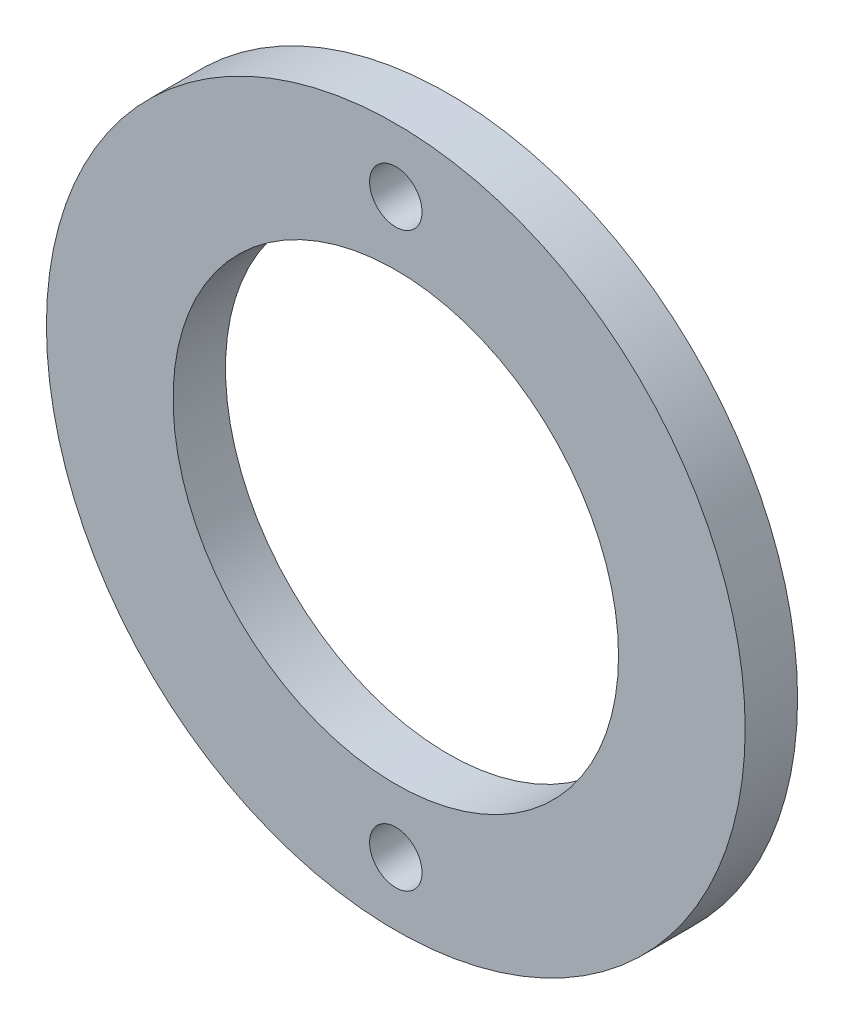
ISO-10303-21;
HEADER;
FILE_DESCRIPTION(('STEP AP214'),'2;1');
FILE_NAME('part.step','',(''),(''),'','','');
FILE_SCHEMA(('AUTOMOTIVE_DESIGN { 1 0 10303 214 1 1 1 1 }'));
ENDSEC;
DATA;
#1=APPLICATION_CONTEXT('core data for automotive mechanical design processes');
#2=APPLICATION_PROTOCOL_DEFINITION('international standard','automotive_design',2000,#1);
#3=PRODUCT_CONTEXT('',#1,'mechanical');
#4=PRODUCT('Part','Part','',(#3));
#5=PRODUCT_RELATED_PRODUCT_CATEGORY('part','',(#4));
#6=PRODUCT_DEFINITION_FORMATION('','',#4);
#7=PRODUCT_DEFINITION_CONTEXT('part definition',#1,'design');
#8=PRODUCT_DEFINITION('design','',#6,#7);
#9=PRODUCT_DEFINITION_SHAPE('','',#8);
#10=(LENGTH_UNIT() NAMED_UNIT(*) SI_UNIT(.MILLI.,.METRE.));
#11=(NAMED_UNIT(*) PLANE_ANGLE_UNIT() SI_UNIT($,.RADIAN.));
#12=(NAMED_UNIT(*) SI_UNIT($,.STERADIAN.) SOLID_ANGLE_UNIT());
#13=UNCERTAINTY_MEASURE_WITH_UNIT(LENGTH_MEASURE(1.E-05),#10,'distance_accuracy_value','');
#14=(GEOMETRIC_REPRESENTATION_CONTEXT(3) GLOBAL_UNCERTAINTY_ASSIGNED_CONTEXT((#13)) GLOBAL_UNIT_ASSIGNED_CONTEXT((#10,
#11,#12)) REPRESENTATION_CONTEXT('',''));
#15=CARTESIAN_POINT('',(0.,0.,0.));
#16=DIRECTION('',(0.,0.,1.));
#17=DIRECTION('',(1.,0.,0.));
#18=AXIS2_PLACEMENT_3D('',#15,#16,#17);
#19=CARTESIAN_POINT('',(0.,0.,3.));
#20=DIRECTION('',(0.,0.,1.));
#21=DIRECTION('',(1.,0.,0.));
#22=AXIS2_PLACEMENT_3D('',#19,#20,#21);
#23=PLANE('',#22);
#24=CARTESIAN_POINT('',(0.,16.375,3.));
#25=DIRECTION('',(0.,0.,1.));
#26=DIRECTION('',(1.,0.,0.));
#27=AXIS2_PLACEMENT_3D('',#24,#25,#26);
#28=CIRCLE('',#27,1.5);
#29=CARTESIAN_POINT('',(1.5,16.375,3.));
#30=VERTEX_POINT('',#29);
#31=EDGE_CURVE('E58',#30,#30,#28,.T.);
#32=ORIENTED_EDGE('',*,*,#31,.F.);
#33=EDGE_LOOP('',(#32));
#34=FACE_BOUND('',#33,.T.);
#35=CARTESIAN_POINT('',(0.,-16.375,3.));
#36=DIRECTION('',(0.,0.,1.));
#37=DIRECTION('',(1.,0.,0.));
#38=AXIS2_PLACEMENT_3D('',#35,#36,#37);
#39=CIRCLE('',#38,1.5);
#40=CARTESIAN_POINT('',(1.5,-16.375,3.));
#41=VERTEX_POINT('',#40);
#42=EDGE_CURVE('E52',#41,#41,#39,.T.);
#43=ORIENTED_EDGE('',*,*,#42,.F.);
#44=EDGE_LOOP('',(#43));
#45=FACE_BOUND('',#44,.T.);
#46=CARTESIAN_POINT('',(0.,0.,3.));
#47=DIRECTION('',(0.,0.,1.));
#48=DIRECTION('',(1.,0.,0.));
#49=AXIS2_PLACEMENT_3D('',#46,#47,#48);
#50=CIRCLE('',#49,20.);
#51=CARTESIAN_POINT('',(20.,0.,3.));
#52=VERTEX_POINT('',#51);
#53=EDGE_CURVE('E10',#52,#52,#50,.T.);
#54=ORIENTED_EDGE('',*,*,#53,.T.);
#55=EDGE_LOOP('',(#54));
#56=FACE_BOUND('',#55,.T.);
#57=CARTESIAN_POINT('',(0.,0.,3.));
#58=DIRECTION('',(0.,0.,1.));
#59=DIRECTION('',(1.,0.,0.));
#60=AXIS2_PLACEMENT_3D('',#57,#58,#59);
#61=CIRCLE('',#60,12.75);
#62=CARTESIAN_POINT('',(12.75,0.,3.));
#63=VERTEX_POINT('',#62);
#64=EDGE_CURVE('E42',#63,#63,#61,.T.);
#65=ORIENTED_EDGE('',*,*,#64,.F.);
#66=EDGE_LOOP('',(#65));
#67=FACE_BOUND('',#66,.T.);
#68=ADVANCED_FACE('F31',(#34,#45,#56,#67),#23,.T.);
#69=CARTESIAN_POINT('',(0.,0.,0.));
#70=DIRECTION('',(0.,0.,1.));
#71=DIRECTION('',(1.,0.,0.));
#72=AXIS2_PLACEMENT_3D('',#69,#70,#71);
#73=PLANE('',#72);
#74=CARTESIAN_POINT('',(0.,16.375,0.));
#75=DIRECTION('',(0.,0.,1.));
#76=DIRECTION('',(1.,0.,0.));
#77=AXIS2_PLACEMENT_3D('',#74,#75,#76);
#78=CIRCLE('',#77,1.5);
#79=CARTESIAN_POINT('',(1.5,16.375,0.));
#80=VERTEX_POINT('',#79);
#81=EDGE_CURVE('E55',#80,#80,#78,.T.);
#82=ORIENTED_EDGE('',*,*,#81,.T.);
#83=EDGE_LOOP('',(#82));
#84=FACE_BOUND('',#83,.T.);
#85=CARTESIAN_POINT('',(0.,-16.375,0.));
#86=DIRECTION('',(0.,0.,1.));
#87=DIRECTION('',(1.,0.,0.));
#88=AXIS2_PLACEMENT_3D('',#85,#86,#87);
#89=CIRCLE('',#88,1.5);
#90=CARTESIAN_POINT('',(1.5,-16.375,0.));
#91=VERTEX_POINT('',#90);
#92=EDGE_CURVE('E47',#91,#91,#89,.T.);
#93=ORIENTED_EDGE('',*,*,#92,.T.);
#94=EDGE_LOOP('',(#93));
#95=FACE_BOUND('',#94,.T.);
#96=CARTESIAN_POINT('',(0.,0.,0.));
#97=DIRECTION('',(0.,0.,1.));
#98=DIRECTION('',(1.,0.,0.));
#99=AXIS2_PLACEMENT_3D('',#96,#97,#98);
#100=CIRCLE('',#99,20.);
#101=CARTESIAN_POINT('',(20.,0.,0.));
#102=VERTEX_POINT('',#101);
#103=EDGE_CURVE('E35',#102,#102,#100,.T.);
#104=ORIENTED_EDGE('',*,*,#103,.F.);
#105=EDGE_LOOP('',(#104));
#106=FACE_BOUND('',#105,.T.);
#107=CARTESIAN_POINT('',(0.,0.,0.));
#108=DIRECTION('',(0.,0.,1.));
#109=DIRECTION('',(1.,0.,0.));
#110=AXIS2_PLACEMENT_3D('',#107,#108,#109);
#111=CIRCLE('',#110,12.75);
#112=CARTESIAN_POINT('',(12.75,0.,0.));
#113=VERTEX_POINT('',#112);
#114=EDGE_CURVE('E44',#113,#113,#111,.T.);
#115=ORIENTED_EDGE('',*,*,#114,.T.);
#116=EDGE_LOOP('',(#115));
#117=FACE_BOUND('',#116,.T.);
#118=ADVANCED_FACE('F66',(#84,#95,#106,#117),#73,.F.);
#119=CARTESIAN_POINT('',(0.,0.,3.));
#120=DIRECTION('',(0.,0.,-1.));
#121=DIRECTION('',(-1.,0.,0.));
#122=AXIS2_PLACEMENT_3D('',#119,#120,#121);
#123=CYLINDRICAL_SURFACE('',#122,20.);
#124=ORIENTED_EDGE('',*,*,#53,.F.);
#125=EDGE_LOOP('',(#124));
#126=FACE_BOUND('',#125,.T.);
#127=ORIENTED_EDGE('',*,*,#103,.T.);
#128=EDGE_LOOP('',(#127));
#129=FACE_BOUND('',#128,.T.);
#130=ADVANCED_FACE('F33',(#126,#129),#123,.T.);
#131=CARTESIAN_POINT('',(0.,0.,3.));
#132=DIRECTION('',(0.,0.,-1.));
#133=DIRECTION('',(-1.,0.,0.));
#134=AXIS2_PLACEMENT_3D('',#131,#132,#133);
#135=CYLINDRICAL_SURFACE('',#134,12.75);
#136=ORIENTED_EDGE('',*,*,#64,.T.);
#137=EDGE_LOOP('',(#136));
#138=FACE_BOUND('',#137,.T.);
#139=ORIENTED_EDGE('',*,*,#114,.F.);
#140=EDGE_LOOP('',(#139));
#141=FACE_BOUND('',#140,.T.);
#142=ADVANCED_FACE('F72',(#138,#141),#135,.F.);
#143=CARTESIAN_POINT('',(0.,-16.375,3.));
#144=DIRECTION('',(0.,0.,1.));
#145=DIRECTION('',(1.,0.,0.));
#146=AXIS2_PLACEMENT_3D('',#143,#144,#145);
#147=CYLINDRICAL_SURFACE('',#146,1.5);
#148=ORIENTED_EDGE('',*,*,#92,.F.);
#149=EDGE_LOOP('',(#148));
#150=FACE_BOUND('',#149,.T.);
#151=ORIENTED_EDGE('',*,*,#42,.T.);
#152=EDGE_LOOP('',(#151));
#153=FACE_BOUND('',#152,.T.);
#154=ADVANCED_FACE('F75',(#150,#153),#147,.F.);
#155=CARTESIAN_POINT('',(0.,16.375,3.));
#156=DIRECTION('',(0.,0.,1.));
#157=DIRECTION('',(1.,0.,0.));
#158=AXIS2_PLACEMENT_3D('',#155,#156,#157);
#159=CYLINDRICAL_SURFACE('',#158,1.5);
#160=ORIENTED_EDGE('',*,*,#81,.F.);
#161=EDGE_LOOP('',(#160));
#162=FACE_BOUND('',#161,.T.);
#163=ORIENTED_EDGE('',*,*,#31,.T.);
#164=EDGE_LOOP('',(#163));
#165=FACE_BOUND('',#164,.T.);
#166=ADVANCED_FACE('F62',(#162,#165),#159,.F.);
#167=CLOSED_SHELL('',(#68,#118,#130,#142,#154,#166));
#168=MANIFOLD_SOLID_BREP('B2',#167);
#169=ADVANCED_BREP_SHAPE_REPRESENTATION('',(#18,#168),#14);
#170=SHAPE_DEFINITION_REPRESENTATION(#9,#169);
ENDSEC;
END-ISO-10303-21;
